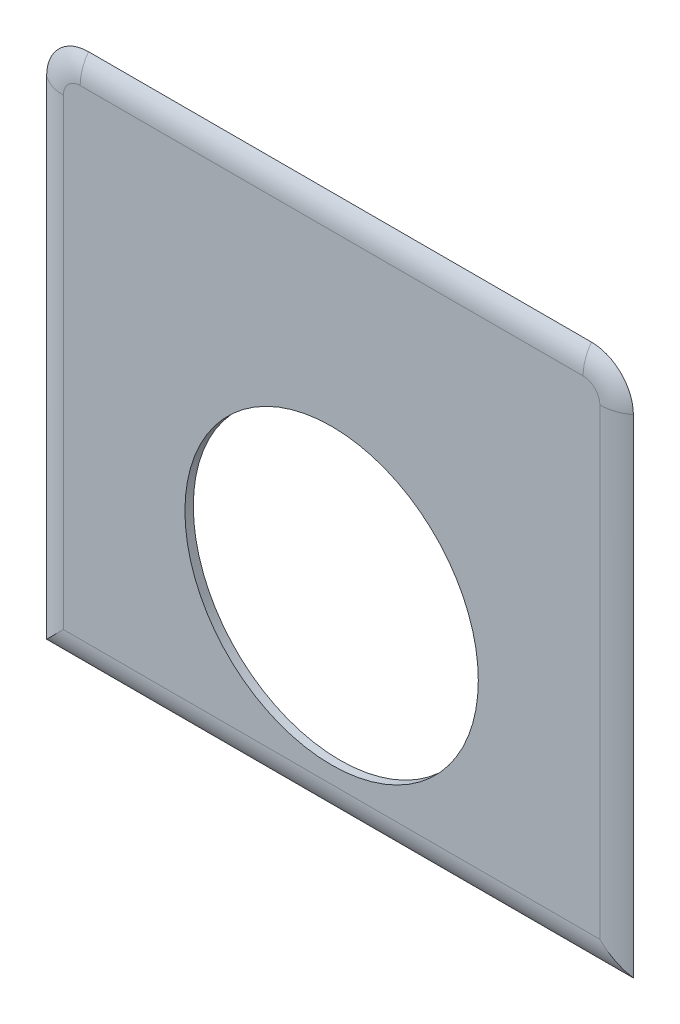
ISO-10303-21;
HEADER;
FILE_DESCRIPTION(('STEP AP214'),'2;1');
FILE_NAME('part.step','',(''),(''),'','','');
FILE_SCHEMA(('AUTOMOTIVE_DESIGN { 1 0 10303 214 1 1 1 1 }'));
ENDSEC;
DATA;
#1=APPLICATION_CONTEXT('core data for automotive mechanical design processes');
#2=APPLICATION_PROTOCOL_DEFINITION('international standard','automotive_design',2000,#1);
#3=PRODUCT_CONTEXT('',#1,'mechanical');
#4=PRODUCT('Part','Part','',(#3));
#5=PRODUCT_RELATED_PRODUCT_CATEGORY('part','',(#4));
#6=PRODUCT_DEFINITION_FORMATION('','',#4);
#7=PRODUCT_DEFINITION_CONTEXT('part definition',#1,'design');
#8=PRODUCT_DEFINITION('design','',#6,#7);
#9=PRODUCT_DEFINITION_SHAPE('','',#8);
#10=(LENGTH_UNIT() NAMED_UNIT(*) SI_UNIT(.MILLI.,.METRE.));
#11=(NAMED_UNIT(*) PLANE_ANGLE_UNIT() SI_UNIT($,.RADIAN.));
#12=(NAMED_UNIT(*) SI_UNIT($,.STERADIAN.) SOLID_ANGLE_UNIT());
#13=UNCERTAINTY_MEASURE_WITH_UNIT(LENGTH_MEASURE(1.E-05),#10,'distance_accuracy_value','');
#14=(GEOMETRIC_REPRESENTATION_CONTEXT(3) GLOBAL_UNCERTAINTY_ASSIGNED_CONTEXT((#13)) GLOBAL_UNIT_ASSIGNED_CONTEXT((#10,
#11,#12)) REPRESENTATION_CONTEXT('',''));
#15=CARTESIAN_POINT('',(0.,0.,0.));
#16=DIRECTION('',(0.,0.,1.));
#17=DIRECTION('',(1.,0.,0.));
#18=AXIS2_PLACEMENT_3D('',#15,#16,#17);
#19=CARTESIAN_POINT('',(0.,0.,2.54));
#20=DIRECTION('',(0.,0.,-1.));
#21=DIRECTION('',(-1.,0.,0.));
#22=AXIS2_PLACEMENT_3D('',#19,#20,#21);
#23=PLANE('',#22);
#24=DIRECTION('',(0.,-1.,0.));
#25=VECTOR('',#24,1.);
#26=CARTESIAN_POINT('',(170.18,0.,2.54));
#27=LINE('',#26,#25);
#28=CARTESIAN_POINT('',(170.18,7.62,2.54));
#29=VERTEX_POINT('',#28);
#30=CARTESIAN_POINT('',(170.18,147.828,2.54));
#31=VERTEX_POINT('',#30);
#32=EDGE_CURVE('E51',#29,#31,#27,.F.);
#33=ORIENTED_EDGE('',*,*,#32,.T.);
#34=CARTESIAN_POINT('',(165.1,147.828,2.54));
#35=DIRECTION('',(0.,0.,-1.));
#36=DIRECTION('',(-1.,0.,0.));
#37=AXIS2_PLACEMENT_3D('',#34,#35,#36);
#38=CIRCLE('',#37,5.08);
#39=CARTESIAN_POINT('',(165.1,152.908,2.54));
#40=VERTEX_POINT('',#39);
#41=EDGE_CURVE('E11',#31,#40,#38,.F.);
#42=ORIENTED_EDGE('',*,*,#41,.T.);
#43=DIRECTION('',(1.,0.,0.));
#44=VECTOR('',#43,1.);
#45=CARTESIAN_POINT('',(0.,152.908,2.54));
#46=LINE('',#45,#44);
#47=CARTESIAN_POINT('',(12.7,152.908,2.54));
#48=VERTEX_POINT('',#47);
#49=EDGE_CURVE('E150',#40,#48,#46,.F.);
#50=ORIENTED_EDGE('',*,*,#49,.T.);
#51=CARTESIAN_POINT('',(12.7,147.828,2.54));
#52=DIRECTION('',(0.,0.,-1.));
#53=DIRECTION('',(-1.,0.,0.));
#54=AXIS2_PLACEMENT_3D('',#51,#52,#53);
#55=CIRCLE('',#54,5.08);
#56=CARTESIAN_POINT('',(7.62,147.828,2.54));
#57=VERTEX_POINT('',#56);
#58=EDGE_CURVE('E147',#48,#57,#55,.F.);
#59=ORIENTED_EDGE('',*,*,#58,.T.);
#60=DIRECTION('',(0.,1.,0.));
#61=VECTOR('',#60,1.);
#62=CARTESIAN_POINT('',(7.62,0.,2.54));
#63=LINE('',#62,#61);
#64=CARTESIAN_POINT('',(7.62,7.62,2.54));
#65=VERTEX_POINT('',#64);
#66=EDGE_CURVE('E144',#57,#65,#63,.F.);
#67=ORIENTED_EDGE('',*,*,#66,.T.);
#68=DIRECTION('',(-1.,0.,0.));
#69=VECTOR('',#68,1.);
#70=CARTESIAN_POINT('',(0.,7.62,2.54));
#71=LINE('',#70,#69);
#72=EDGE_CURVE('E62',#65,#29,#71,.F.);
#73=ORIENTED_EDGE('',*,*,#72,.T.);
#74=EDGE_LOOP('',(#33,#42,#50,#59,#67,#73));
#75=FACE_BOUND('',#74,.T.);
#76=CARTESIAN_POINT('',(88.9,57.15,2.54));
#77=DIRECTION('',(0.,0.,1.));
#78=DIRECTION('',(1.,0.,0.));
#79=AXIS2_PLACEMENT_3D('',#76,#77,#78);
#80=CIRCLE('',#79,44.45);
#81=CARTESIAN_POINT('',(133.35,57.15,2.54));
#82=VERTEX_POINT('',#81);
#83=EDGE_CURVE('E115',#82,#82,#80,.T.);
#84=ORIENTED_EDGE('',*,*,#83,.F.);
#85=EDGE_LOOP('',(#84));
#86=FACE_BOUND('',#85,.T.);
#87=ADVANCED_FACE('F41',(#75,#86),#23,.F.);
#88=CARTESIAN_POINT('',(0.,0.,0.));
#89=DIRECTION('',(0.,0.,-1.));
#90=DIRECTION('',(-1.,0.,0.));
#91=AXIS2_PLACEMENT_3D('',#88,#89,#90);
#92=PLANE('',#91);
#93=DIRECTION('',(0.,-1.,0.));
#94=VECTOR('',#93,1.);
#95=CARTESIAN_POINT('',(0.,0.,0.));
#96=LINE('',#95,#94);
#97=CARTESIAN_POINT('',(0.,147.828,0.));
#98=VERTEX_POINT('',#97);
#99=CARTESIAN_POINT('',(0.,0.,0.));
#100=VERTEX_POINT('',#99);
#101=EDGE_CURVE('E98',#98,#100,#96,.T.);
#102=ORIENTED_EDGE('',*,*,#101,.F.);
#103=CARTESIAN_POINT('',(12.7,147.828,0.));
#104=DIRECTION('',(0.,0.,-1.));
#105=DIRECTION('',(-1.,0.,0.));
#106=AXIS2_PLACEMENT_3D('',#103,#104,#105);
#107=CIRCLE('',#106,12.7);
#108=CARTESIAN_POINT('',(12.7,160.528,0.));
#109=VERTEX_POINT('',#108);
#110=EDGE_CURVE('E153',#98,#109,#107,.T.);
#111=ORIENTED_EDGE('',*,*,#110,.T.);
#112=DIRECTION('',(-1.,0.,0.));
#113=VECTOR('',#112,1.);
#114=CARTESIAN_POINT('',(0.,160.528,0.));
#115=LINE('',#114,#113);
#116=CARTESIAN_POINT('',(165.1,160.528,0.));
#117=VERTEX_POINT('',#116);
#118=EDGE_CURVE('E159',#117,#109,#115,.T.);
#119=ORIENTED_EDGE('',*,*,#118,.F.);
#120=CARTESIAN_POINT('',(165.1,147.828,0.));
#121=DIRECTION('',(0.,0.,-1.));
#122=DIRECTION('',(-1.,0.,0.));
#123=AXIS2_PLACEMENT_3D('',#120,#121,#122);
#124=CIRCLE('',#123,12.7);
#125=CARTESIAN_POINT('',(177.8,147.828,0.));
#126=VERTEX_POINT('',#125);
#127=EDGE_CURVE('E156',#117,#126,#124,.T.);
#128=ORIENTED_EDGE('',*,*,#127,.T.);
#129=DIRECTION('',(0.,1.,0.));
#130=VECTOR('',#129,1.);
#131=CARTESIAN_POINT('',(177.8,0.,0.));
#132=LINE('',#131,#130);
#133=CARTESIAN_POINT('',(177.8,0.,0.));
#134=VERTEX_POINT('',#133);
#135=EDGE_CURVE('E102',#134,#126,#132,.T.);
#136=ORIENTED_EDGE('',*,*,#135,.F.);
#137=DIRECTION('',(1.,0.,0.));
#138=VECTOR('',#137,1.);
#139=CARTESIAN_POINT('',(0.,0.,0.));
#140=LINE('',#139,#138);
#141=EDGE_CURVE('E94',#100,#134,#140,.T.);
#142=ORIENTED_EDGE('',*,*,#141,.F.);
#143=EDGE_LOOP('',(#102,#111,#119,#128,#136,#142));
#144=FACE_BOUND('',#143,.T.);
#145=CARTESIAN_POINT('',(88.9,57.15,0.));
#146=DIRECTION('',(0.,0.,1.));
#147=DIRECTION('',(1.,0.,0.));
#148=AXIS2_PLACEMENT_3D('',#145,#146,#147);
#149=CIRCLE('',#148,44.45);
#150=CARTESIAN_POINT('',(133.35,57.15,0.));
#151=VERTEX_POINT('',#150);
#152=EDGE_CURVE('E119',#151,#151,#149,.T.);
#153=ORIENTED_EDGE('',*,*,#152,.T.);
#154=EDGE_LOOP('',(#153));
#155=FACE_BOUND('',#154,.T.);
#156=ADVANCED_FACE('F96',(#144,#155),#92,.T.);
#157=CARTESIAN_POINT('',(88.9,57.15,2.54));
#158=DIRECTION('',(0.,0.,-1.));
#159=DIRECTION('',(-1.,0.,0.));
#160=AXIS2_PLACEMENT_3D('',#157,#158,#159);
#161=CYLINDRICAL_SURFACE('',#160,44.45);
#162=ORIENTED_EDGE('',*,*,#83,.T.);
#163=EDGE_LOOP('',(#162));
#164=FACE_BOUND('',#163,.T.);
#165=ORIENTED_EDGE('',*,*,#152,.F.);
#166=EDGE_LOOP('',(#165));
#167=FACE_BOUND('',#166,.T.);
#168=ADVANCED_FACE('F169',(#164,#167),#161,.F.);
#169=CARTESIAN_POINT('',(7.62,0.,-10.16));
#170=DIRECTION('',(0.,1.,0.));
#171=DIRECTION('',(0.,0.,1.));
#172=AXIS2_PLACEMENT_3D('',#169,#170,#171);
#173=CYLINDRICAL_SURFACE('',#172,12.7);
#174=CARTESIAN_POINT('',(7.6200000000008,147.828,-10.16));
#175=DIRECTION('',(0.,1.,0.));
#176=DIRECTION('',(0.,0.,1.));
#177=AXIS2_PLACEMENT_3D('',#174,#175,#176);
#178=CIRCLE('',#177,12.7);
#179=EDGE_CURVE('E112',#98,#57,#178,.T.);
#180=ORIENTED_EDGE('',*,*,#179,.F.);
#181=ORIENTED_EDGE('',*,*,#101,.T.);
#182=CARTESIAN_POINT('',(7.62,7.62,-10.16));
#183=DIRECTION('',(-0.707106781186547,0.707106781186547,0.));
#184=DIRECTION('',(0.707106781186547,0.707106781186547,0.));
#185=AXIS2_PLACEMENT_3D('',#182,#183,#184);
#186=ELLIPSE('',#185,17.9605122421383,12.7);
#187=EDGE_CURVE('E45',#65,#100,#186,.F.);
#188=ORIENTED_EDGE('',*,*,#187,.F.);
#189=ORIENTED_EDGE('',*,*,#66,.F.);
#190=EDGE_LOOP('',(#180,#181,#188,#189));
#191=FACE_BOUND('',#190,.T.);
#192=ADVANCED_FACE('F43',(#191),#173,.T.);
#193=CARTESIAN_POINT('',(0.,7.62,-10.16));
#194=DIRECTION('',(-1.,0.,0.));
#195=DIRECTION('',(0.,0.,1.));
#196=AXIS2_PLACEMENT_3D('',#193,#194,#195);
#197=CYLINDRICAL_SURFACE('',#196,12.7);
#198=ORIENTED_EDGE('',*,*,#187,.T.);
#199=ORIENTED_EDGE('',*,*,#141,.T.);
#200=CARTESIAN_POINT('',(170.18,7.62,-10.16));
#201=DIRECTION('',(-0.707106781186547,-0.707106781186547,0.));
#202=DIRECTION('',(-0.707106781186547,0.707106781186547,0.));
#203=AXIS2_PLACEMENT_3D('',#200,#201,#202);
#204=ELLIPSE('',#203,17.9605122421383,12.7);
#205=EDGE_CURVE('E124',#29,#134,#204,.F.);
#206=ORIENTED_EDGE('',*,*,#205,.F.);
#207=ORIENTED_EDGE('',*,*,#72,.F.);
#208=EDGE_LOOP('',(#198,#199,#206,#207));
#209=FACE_BOUND('',#208,.T.);
#210=ADVANCED_FACE('F117',(#209),#197,.T.);
#211=CARTESIAN_POINT('',(12.7,147.828,-10.16));
#212=DIRECTION('',(0.,0.,1.));
#213=DIRECTION('',(1.,0.,0.));
#214=AXIS2_PLACEMENT_3D('',#211,#212,#213);
#215=DEGENERATE_TOROIDAL_SURFACE('',#214,5.08,12.7,.T.);
#216=ORIENTED_EDGE('',*,*,#179,.T.);
#217=ORIENTED_EDGE('',*,*,#58,.F.);
#218=CARTESIAN_POINT('',(12.7,152.907999999999,-10.16));
#219=DIRECTION('',(1.,0.,0.));
#220=DIRECTION('',(0.,1.,0.));
#221=AXIS2_PLACEMENT_3D('',#218,#219,#220);
#222=CIRCLE('',#221,12.7);
#223=EDGE_CURVE('E128',#109,#48,#222,.T.);
#224=ORIENTED_EDGE('',*,*,#223,.F.);
#225=ORIENTED_EDGE('',*,*,#110,.F.);
#226=EDGE_LOOP('',(#216,#217,#224,#225));
#227=FACE_BOUND('',#226,.T.);
#228=ADVANCED_FACE('F191',(#227),#215,.T.);
#229=CARTESIAN_POINT('',(170.18,0.,-10.16));
#230=DIRECTION('',(0.,-1.,0.));
#231=DIRECTION('',(0.,0.,-1.));
#232=AXIS2_PLACEMENT_3D('',#229,#230,#231);
#233=CYLINDRICAL_SURFACE('',#232,12.7);
#234=ORIENTED_EDGE('',*,*,#205,.T.);
#235=ORIENTED_EDGE('',*,*,#135,.T.);
#236=CARTESIAN_POINT('',(170.18,147.828,-10.16));
#237=DIRECTION('',(0.,1.,0.));
#238=DIRECTION('',(0.,0.,1.));
#239=AXIS2_PLACEMENT_3D('',#236,#237,#238);
#240=CIRCLE('',#239,12.7);
#241=EDGE_CURVE('E134',#31,#126,#240,.T.);
#242=ORIENTED_EDGE('',*,*,#241,.F.);
#243=ORIENTED_EDGE('',*,*,#32,.F.);
#244=EDGE_LOOP('',(#234,#235,#242,#243));
#245=FACE_BOUND('',#244,.T.);
#246=ADVANCED_FACE('F187',(#245),#233,.T.);
#247=CARTESIAN_POINT('',(0.,152.908,-10.16));
#248=DIRECTION('',(1.,0.,0.));
#249=DIRECTION('',(0.,1.,0.));
#250=AXIS2_PLACEMENT_3D('',#247,#248,#249);
#251=CYLINDRICAL_SURFACE('',#250,12.7);
#252=ORIENTED_EDGE('',*,*,#223,.T.);
#253=ORIENTED_EDGE('',*,*,#49,.F.);
#254=CARTESIAN_POINT('',(165.1,152.907999999999,-10.16));
#255=DIRECTION('',(1.,0.,0.));
#256=DIRECTION('',(0.,0.,-1.));
#257=AXIS2_PLACEMENT_3D('',#254,#255,#256);
#258=CIRCLE('',#257,12.7);
#259=EDGE_CURVE('E137',#117,#40,#258,.T.);
#260=ORIENTED_EDGE('',*,*,#259,.F.);
#261=ORIENTED_EDGE('',*,*,#118,.T.);
#262=EDGE_LOOP('',(#252,#253,#260,#261));
#263=FACE_BOUND('',#262,.T.);
#264=ADVANCED_FACE('F183',(#263),#251,.T.);
#265=CARTESIAN_POINT('',(165.1,147.828,-10.16));
#266=DIRECTION('',(0.,0.,1.));
#267=DIRECTION('',(1.,0.,0.));
#268=AXIS2_PLACEMENT_3D('',#265,#266,#267);
#269=DEGENERATE_TOROIDAL_SURFACE('',#268,5.08,12.7,.T.);
#270=ORIENTED_EDGE('',*,*,#241,.T.);
#271=ORIENTED_EDGE('',*,*,#127,.F.);
#272=ORIENTED_EDGE('',*,*,#259,.T.);
#273=ORIENTED_EDGE('',*,*,#41,.F.);
#274=EDGE_LOOP('',(#270,#271,#272,#273));
#275=FACE_BOUND('',#274,.T.);
#276=ADVANCED_FACE('F180',(#275),#269,.T.);
#277=CLOSED_SHELL('',(#87,#156,#168,#192,#210,#228,#246,#264,#276));
#278=MANIFOLD_SOLID_BREP('B2',#277);
#279=ADVANCED_BREP_SHAPE_REPRESENTATION('',(#18,#278),#14);
#280=SHAPE_DEFINITION_REPRESENTATION(#9,#279);
ENDSEC;
END-ISO-10303-21;
